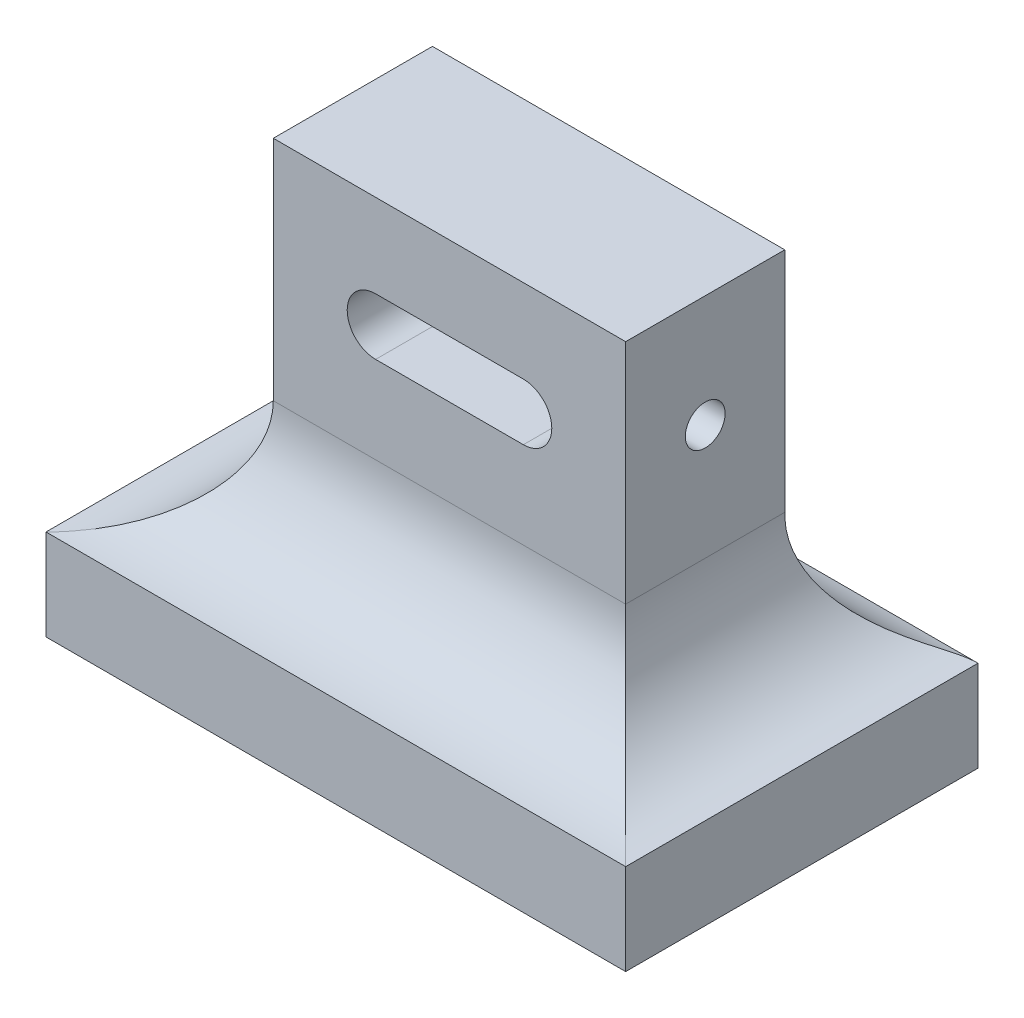
ISO-10303-21;
HEADER;
FILE_DESCRIPTION(('STEP AP214'),'2;1');
FILE_NAME('part.step','',(''),(''),'','','');
FILE_SCHEMA(('AUTOMOTIVE_DESIGN { 1 0 10303 214 1 1 1 1 }'));
ENDSEC;
DATA;
#1=APPLICATION_CONTEXT('core data for automotive mechanical design processes');
#2=APPLICATION_PROTOCOL_DEFINITION('international standard','automotive_design',2000,#1);
#3=PRODUCT_CONTEXT('',#1,'mechanical');
#4=PRODUCT('Part','Part','',(#3));
#5=PRODUCT_RELATED_PRODUCT_CATEGORY('part','',(#4));
#6=PRODUCT_DEFINITION_FORMATION('','',#4);
#7=PRODUCT_DEFINITION_CONTEXT('part definition',#1,'design');
#8=PRODUCT_DEFINITION('design','',#6,#7);
#9=PRODUCT_DEFINITION_SHAPE('','',#8);
#10=(LENGTH_UNIT() NAMED_UNIT(*) SI_UNIT(.MILLI.,.METRE.));
#11=(NAMED_UNIT(*) PLANE_ANGLE_UNIT() SI_UNIT($,.RADIAN.));
#12=(NAMED_UNIT(*) SI_UNIT($,.STERADIAN.) SOLID_ANGLE_UNIT());
#13=UNCERTAINTY_MEASURE_WITH_UNIT(LENGTH_MEASURE(1.E-05),#10,'distance_accuracy_value','');
#14=(GEOMETRIC_REPRESENTATION_CONTEXT(3) GLOBAL_UNCERTAINTY_ASSIGNED_CONTEXT((#13)) GLOBAL_UNIT_ASSIGNED_CONTEXT((#10,
#11,#12)) REPRESENTATION_CONTEXT('',''));
#15=CARTESIAN_POINT('',(0.,0.,0.));
#16=DIRECTION('',(0.,0.,1.));
#17=DIRECTION('',(1.,0.,0.));
#18=AXIS2_PLACEMENT_3D('',#15,#16,#17);
#19=CARTESIAN_POINT('',(0.,8.,0.));
#20=DIRECTION('',(1.,0.,0.));
#21=DIRECTION('',(0.,0.,-1.));
#22=AXIS2_PLACEMENT_3D('',#19,#20,#21);
#23=PLANE('',#22);
#24=DIRECTION('',(0.,0.,1.));
#25=VECTOR('',#24,1.);
#26=CARTESIAN_POINT('',(0.,0.,0.));
#27=LINE('',#26,#25);
#28=CARTESIAN_POINT('',(0.,0.,-31.));
#29=VERTEX_POINT('',#28);
#30=CARTESIAN_POINT('',(0.,0.,0.));
#31=VERTEX_POINT('',#30);
#32=EDGE_CURVE('E188',#29,#31,#27,.T.);
#33=ORIENTED_EDGE('',*,*,#32,.T.);
#34=DIRECTION('',(0.,-1.,0.));
#35=VECTOR('',#34,1.);
#36=CARTESIAN_POINT('',(0.,8.,0.));
#37=LINE('',#36,#35);
#38=CARTESIAN_POINT('',(0.,8.,0.));
#39=VERTEX_POINT('',#38);
#40=EDGE_CURVE('E226',#39,#31,#37,.T.);
#41=ORIENTED_EDGE('',*,*,#40,.F.);
#42=DIRECTION('',(0.,0.,1.));
#43=VECTOR('',#42,1.);
#44=CARTESIAN_POINT('',(0.,8.,0.));
#45=LINE('',#44,#43);
#46=CARTESIAN_POINT('',(0.,8.,-31.));
#47=VERTEX_POINT('',#46);
#48=EDGE_CURVE('E197',#47,#39,#45,.T.);
#49=ORIENTED_EDGE('',*,*,#48,.F.);
#50=DIRECTION('',(0.,-1.,0.));
#51=VECTOR('',#50,1.);
#52=CARTESIAN_POINT('',(0.,8.,-31.));
#53=LINE('',#52,#51);
#54=EDGE_CURVE('E210',#47,#29,#53,.T.);
#55=ORIENTED_EDGE('',*,*,#54,.T.);
#56=EDGE_LOOP('',(#33,#41,#49,#55));
#57=FACE_BOUND('',#56,.T.);
#58=ADVANCED_FACE('F35',(#57),#23,.F.);
#59=CARTESIAN_POINT('',(0.,8.,0.));
#60=DIRECTION('',(0.,0.,-1.));
#61=DIRECTION('',(-1.,0.,0.));
#62=AXIS2_PLACEMENT_3D('',#59,#60,#61);
#63=PLANE('',#62);
#64=DIRECTION('',(1.,0.,0.));
#65=VECTOR('',#64,1.);
#66=CARTESIAN_POINT('',(0.,0.,0.));
#67=LINE('',#66,#65);
#68=CARTESIAN_POINT('',(51.,0.,0.));
#69=VERTEX_POINT('',#68);
#70=EDGE_CURVE('E213',#31,#69,#67,.T.);
#71=ORIENTED_EDGE('',*,*,#70,.T.);
#72=DIRECTION('',(0.,-1.,0.));
#73=VECTOR('',#72,1.);
#74=CARTESIAN_POINT('',(51.,8.,0.));
#75=LINE('',#74,#73);
#76=CARTESIAN_POINT('',(51.,8.,0.));
#77=VERTEX_POINT('',#76);
#78=EDGE_CURVE('E223',#77,#69,#75,.T.);
#79=ORIENTED_EDGE('',*,*,#78,.F.);
#80=DIRECTION('',(1.,0.,0.));
#81=VECTOR('',#80,1.);
#82=CARTESIAN_POINT('',(0.,8.,0.));
#83=LINE('',#82,#81);
#84=EDGE_CURVE('E200',#39,#77,#83,.T.);
#85=ORIENTED_EDGE('',*,*,#84,.F.);
#86=ORIENTED_EDGE('',*,*,#40,.T.);
#87=EDGE_LOOP('',(#71,#79,#85,#86));
#88=FACE_BOUND('',#87,.T.);
#89=ADVANCED_FACE('F287',(#88),#63,.F.);
#90=CARTESIAN_POINT('',(51.,8.,0.));
#91=DIRECTION('',(-1.,0.,0.));
#92=DIRECTION('',(0.,0.,1.));
#93=AXIS2_PLACEMENT_3D('',#90,#91,#92);
#94=PLANE('',#93);
#95=DIRECTION('',(0.,0.,-1.));
#96=VECTOR('',#95,1.);
#97=CARTESIAN_POINT('',(51.,0.,0.));
#98=LINE('',#97,#96);
#99=CARTESIAN_POINT('',(51.,0.,-31.));
#100=VERTEX_POINT('',#99);
#101=EDGE_CURVE('E215',#69,#100,#98,.T.);
#102=ORIENTED_EDGE('',*,*,#101,.T.);
#103=DIRECTION('',(0.,-1.,0.));
#104=VECTOR('',#103,1.);
#105=CARTESIAN_POINT('',(51.,8.,-31.));
#106=LINE('',#105,#104);
#107=CARTESIAN_POINT('',(51.,8.,-31.));
#108=VERTEX_POINT('',#107);
#109=EDGE_CURVE('E220',#108,#100,#106,.T.);
#110=ORIENTED_EDGE('',*,*,#109,.F.);
#111=DIRECTION('',(0.,0.,-1.));
#112=VECTOR('',#111,1.);
#113=CARTESIAN_POINT('',(51.,8.,0.));
#114=LINE('',#113,#112);
#115=EDGE_CURVE('E204',#77,#108,#114,.T.);
#116=ORIENTED_EDGE('',*,*,#115,.F.);
#117=ORIENTED_EDGE('',*,*,#78,.T.);
#118=EDGE_LOOP('',(#102,#110,#116,#117));
#119=FACE_BOUND('',#118,.T.);
#120=ADVANCED_FACE('F283',(#119),#94,.F.);
#121=CARTESIAN_POINT('',(0.,8.,-31.));
#122=DIRECTION('',(0.,0.,1.));
#123=DIRECTION('',(1.,0.,0.));
#124=AXIS2_PLACEMENT_3D('',#121,#122,#123);
#125=PLANE('',#124);
#126=DIRECTION('',(-1.,0.,0.));
#127=VECTOR('',#126,1.);
#128=CARTESIAN_POINT('',(0.,0.,-31.));
#129=LINE('',#128,#127);
#130=EDGE_CURVE('E201',#100,#29,#129,.T.);
#131=ORIENTED_EDGE('',*,*,#130,.T.);
#132=ORIENTED_EDGE('',*,*,#54,.F.);
#133=DIRECTION('',(-1.,0.,0.));
#134=VECTOR('',#133,1.);
#135=CARTESIAN_POINT('',(0.,8.,-31.));
#136=LINE('',#135,#134);
#137=EDGE_CURVE('E207',#108,#47,#136,.T.);
#138=ORIENTED_EDGE('',*,*,#137,.F.);
#139=ORIENTED_EDGE('',*,*,#109,.T.);
#140=EDGE_LOOP('',(#131,#132,#138,#139));
#141=FACE_BOUND('',#140,.T.);
#142=ADVANCED_FACE('F279',(#141),#125,.F.);
#143=CARTESIAN_POINT('',(0.,0.,0.));
#144=DIRECTION('',(0.,-1.,0.));
#145=DIRECTION('',(0.,0.,-1.));
#146=AXIS2_PLACEMENT_3D('',#143,#144,#145);
#147=PLANE('',#146);
#148=ORIENTED_EDGE('',*,*,#32,.F.);
#149=ORIENTED_EDGE('',*,*,#130,.F.);
#150=ORIENTED_EDGE('',*,*,#101,.F.);
#151=ORIENTED_EDGE('',*,*,#70,.F.);
#152=EDGE_LOOP('',(#148,#149,#150,#151));
#153=FACE_BOUND('',#152,.T.);
#154=ADVANCED_FACE('F275',(#153),#147,.T.);
#155=CARTESIAN_POINT('',(41.,38.,-24.));
#156=DIRECTION('',(1.,0.,0.));
#157=DIRECTION('',(0.,0.,-1.));
#158=AXIS2_PLACEMENT_3D('',#155,#156,#157);
#159=PLANE('',#158);
#160=CARTESIAN_POINT('',(41.,28.15,-17.));
#161=DIRECTION('',(1.,0.,0.));
#162=DIRECTION('',(0.,0.,-1.));
#163=AXIS2_PLACEMENT_3D('',#160,#161,#162);
#164=CIRCLE('',#163,1.75);
#165=CARTESIAN_POINT('',(41.,28.15,-18.75));
#166=VERTEX_POINT('',#165);
#167=EDGE_CURVE('E511',#166,#166,#164,.T.);
#168=ORIENTED_EDGE('',*,*,#167,.F.);
#169=EDGE_LOOP('',(#168));
#170=FACE_BOUND('',#169,.T.);
#171=DIRECTION('',(0.,-1.,0.));
#172=VECTOR('',#171,1.);
#173=CARTESIAN_POINT('',(41.,38.,-10.));
#174=LINE('',#173,#172);
#175=CARTESIAN_POINT('',(41.,38.,-10.));
#176=VERTEX_POINT('',#175);
#177=CARTESIAN_POINT('',(41.,18.,-10.));
#178=VERTEX_POINT('',#177);
#179=EDGE_CURVE('E185',#176,#178,#174,.T.);
#180=ORIENTED_EDGE('',*,*,#179,.T.);
#181=DIRECTION('',(0.,0.,1.));
#182=VECTOR('',#181,1.);
#183=CARTESIAN_POINT('',(41.,18.,-24.));
#184=LINE('',#183,#182);
#185=CARTESIAN_POINT('',(41.,18.,-24.));
#186=VERTEX_POINT('',#185);
#187=EDGE_CURVE('E239',#178,#186,#184,.F.);
#188=ORIENTED_EDGE('',*,*,#187,.T.);
#189=DIRECTION('',(0.,-1.,0.));
#190=VECTOR('',#189,1.);
#191=CARTESIAN_POINT('',(41.,38.,-24.));
#192=LINE('',#191,#190);
#193=CARTESIAN_POINT('',(41.,38.,-24.));
#194=VERTEX_POINT('',#193);
#195=EDGE_CURVE('E186',#194,#186,#192,.T.);
#196=ORIENTED_EDGE('',*,*,#195,.F.);
#197=DIRECTION('',(0.,0.,1.));
#198=VECTOR('',#197,1.);
#199=CARTESIAN_POINT('',(41.,38.,-24.));
#200=LINE('',#199,#198);
#201=EDGE_CURVE('E173',#194,#176,#200,.T.);
#202=ORIENTED_EDGE('',*,*,#201,.T.);
#203=EDGE_LOOP('',(#180,#188,#196,#202));
#204=FACE_BOUND('',#203,.T.);
#205=ADVANCED_FACE('F262',(#170,#204),#159,.T.);
#206=CARTESIAN_POINT('',(41.,38.,-24.));
#207=DIRECTION('',(0.,0.,1.));
#208=DIRECTION('',(1.,0.,0.));
#209=AXIS2_PLACEMENT_3D('',#206,#207,#208);
#210=PLANE('',#209);
#211=DIRECTION('',(-1.,0.,0.));
#212=VECTOR('',#211,1.);
#213=CARTESIAN_POINT('',(32.0000000974318,25.65,-24.));
#214=LINE('',#213,#212);
#215=CARTESIAN_POINT('',(32.0000000974318,25.65,-24.));
#216=VERTEX_POINT('',#215);
#217=CARTESIAN_POINT('',(18.9999999025682,25.65,-24.));
#218=VERTEX_POINT('',#217);
#219=EDGE_CURVE('E157',#216,#218,#214,.T.);
#220=ORIENTED_EDGE('',*,*,#219,.F.);
#221=CARTESIAN_POINT('',(32.0000000974318,28.15,-24.));
#222=DIRECTION('',(0.,0.,-1.));
#223=DIRECTION('',(1.,0.,0.));
#224=AXIS2_PLACEMENT_3D('',#221,#222,#223);
#225=CIRCLE('',#224,2.5);
#226=CARTESIAN_POINT('',(32.0000000974318,30.65,-24.));
#227=VERTEX_POINT('',#226);
#228=EDGE_CURVE('E162',#227,#216,#225,.T.);
#229=ORIENTED_EDGE('',*,*,#228,.F.);
#230=DIRECTION('',(1.,0.,0.));
#231=VECTOR('',#230,1.);
#232=CARTESIAN_POINT('',(32.0000000974318,30.65,-24.));
#233=LINE('',#232,#231);
#234=CARTESIAN_POINT('',(18.9999999025682,30.65,-24.));
#235=VERTEX_POINT('',#234);
#236=EDGE_CURVE('E166',#235,#227,#233,.T.);
#237=ORIENTED_EDGE('',*,*,#236,.F.);
#238=CARTESIAN_POINT('',(18.9999999025682,28.15,-24.));
#239=DIRECTION('',(0.,0.,-1.));
#240=DIRECTION('',(-1.,0.,0.));
#241=AXIS2_PLACEMENT_3D('',#238,#239,#240);
#242=CIRCLE('',#241,2.5);
#243=EDGE_CURVE('E146',#218,#235,#242,.T.);
#244=ORIENTED_EDGE('',*,*,#243,.F.);
#245=EDGE_LOOP('',(#220,#229,#237,#244));
#246=FACE_BOUND('',#245,.T.);
#247=CARTESIAN_POINT('',(51.,18.,-24.));
#248=DIRECTION('',(0.,0.,1.));
#249=DIRECTION('',(1.,0.,0.));
#250=AXIS2_PLACEMENT_3D('',#247,#248,#249);
#251=CIRCLE('',#250,10.);
#252=CARTESIAN_POINT('',(41.0106136182752,17.5393920141695,-24.));
#253=VERTEX_POINT('',#252);
#254=EDGE_CURVE('E56',#186,#253,#251,.T.);
#255=ORIENTED_EDGE('',*,*,#254,.T.);
#256=CARTESIAN_POINT('',(41.0106136182752,17.5393920141695,-24.));
#257=CARTESIAN_POINT('',(41.,17.5393920141695,-24.));
#258=B_SPLINE_CURVE_WITH_KNOTS('',1,(#256,#257),.UNSPECIFIED.,.F.,.F.,(2,2),(0.,1.),.UNSPECIFIED.);
#259=CARTESIAN_POINT('',(41.,17.5393920141695,-24.));
#260=VERTEX_POINT('',#259);
#261=EDGE_CURVE('E11',#253,#260,#258,.T.);
#262=ORIENTED_EDGE('',*,*,#261,.T.);
#263=DIRECTION('',(-1.,0.,0.));
#264=VECTOR('',#263,1.);
#265=CARTESIAN_POINT('',(41.,17.5393920141695,-24.));
#266=LINE('',#265,#264);
#267=CARTESIAN_POINT('',(9.99999999999999,17.5393920141695,-24.));
#268=VERTEX_POINT('',#267);
#269=EDGE_CURVE('E243',#260,#268,#266,.T.);
#270=ORIENTED_EDGE('',*,*,#269,.T.);
#271=CARTESIAN_POINT('',(9.99999999999999,17.5393920141695,-24.));
#272=CARTESIAN_POINT('',(9.9893863817248,17.5393920141695,-24.));
#273=B_SPLINE_CURVE_WITH_KNOTS('',1,(#271,#272),.UNSPECIFIED.,.F.,.F.,(2,2),(0.,1.),.UNSPECIFIED.);
#274=CARTESIAN_POINT('',(9.9893863817248,17.5393920141695,-24.));
#275=VERTEX_POINT('',#274);
#276=EDGE_CURVE('E49',#268,#275,#273,.T.);
#277=ORIENTED_EDGE('',*,*,#276,.T.);
#278=CARTESIAN_POINT('',(0.,18.,-24.));
#279=DIRECTION('',(0.,0.,1.));
#280=DIRECTION('',(1.,0.,0.));
#281=AXIS2_PLACEMENT_3D('',#278,#279,#280);
#282=CIRCLE('',#281,10.);
#283=CARTESIAN_POINT('',(9.99999999999999,18.,-24.));
#284=VERTEX_POINT('',#283);
#285=EDGE_CURVE('E245',#275,#284,#282,.T.);
#286=ORIENTED_EDGE('',*,*,#285,.T.);
#287=DIRECTION('',(0.,-1.,0.));
#288=VECTOR('',#287,1.);
#289=CARTESIAN_POINT('',(9.99999999999999,38.,-24.));
#290=LINE('',#289,#288);
#291=CARTESIAN_POINT('',(9.99999999999999,38.,-24.));
#292=VERTEX_POINT('',#291);
#293=EDGE_CURVE('E189',#292,#284,#290,.T.);
#294=ORIENTED_EDGE('',*,*,#293,.F.);
#295=DIRECTION('',(-1.,0.,0.));
#296=VECTOR('',#295,1.);
#297=CARTESIAN_POINT('',(41.,38.,-24.));
#298=LINE('',#297,#296);
#299=EDGE_CURVE('E183',#194,#292,#298,.T.);
#300=ORIENTED_EDGE('',*,*,#299,.F.);
#301=ORIENTED_EDGE('',*,*,#195,.T.);
#302=EDGE_LOOP('',(#255,#262,#270,#277,#286,#294,#300,#301));
#303=FACE_BOUND('',#302,.T.);
#304=ADVANCED_FACE('F164',(#246,#303),#210,.F.);
#305=CARTESIAN_POINT('',(9.99999999999999,38.,-24.));
#306=DIRECTION('',(1.,0.,0.));
#307=DIRECTION('',(0.,0.,-1.));
#308=AXIS2_PLACEMENT_3D('',#305,#306,#307);
#309=PLANE('',#308);
#310=CARTESIAN_POINT('',(9.99999999999999,28.15,-17.));
#311=DIRECTION('',(1.,0.,0.));
#312=DIRECTION('',(0.,0.,-1.));
#313=AXIS2_PLACEMENT_3D('',#310,#311,#312);
#314=CIRCLE('',#313,1.75);
#315=CARTESIAN_POINT('',(9.99999999999999,28.15,-18.75));
#316=VERTEX_POINT('',#315);
#317=EDGE_CURVE('E323',#316,#316,#314,.T.);
#318=ORIENTED_EDGE('',*,*,#317,.T.);
#319=EDGE_LOOP('',(#318));
#320=FACE_BOUND('',#319,.T.);
#321=ORIENTED_EDGE('',*,*,#293,.T.);
#322=DIRECTION('',(0.,0.,1.));
#323=VECTOR('',#322,1.);
#324=CARTESIAN_POINT('',(9.99999999999999,18.,-10.));
#325=LINE('',#324,#323);
#326=CARTESIAN_POINT('',(9.99999999999999,18.,-10.));
#327=VERTEX_POINT('',#326);
#328=EDGE_CURVE('E236',#284,#327,#325,.T.);
#329=ORIENTED_EDGE('',*,*,#328,.T.);
#330=DIRECTION('',(0.,-1.,0.));
#331=VECTOR('',#330,1.);
#332=CARTESIAN_POINT('',(9.99999999999999,38.,-10.));
#333=LINE('',#332,#331);
#334=CARTESIAN_POINT('',(9.99999999999999,38.,-10.));
#335=VERTEX_POINT('',#334);
#336=EDGE_CURVE('E192',#335,#327,#333,.T.);
#337=ORIENTED_EDGE('',*,*,#336,.F.);
#338=DIRECTION('',(0.,0.,1.));
#339=VECTOR('',#338,1.);
#340=CARTESIAN_POINT('',(9.99999999999999,38.,-24.));
#341=LINE('',#340,#339);
#342=EDGE_CURVE('E181',#292,#335,#341,.T.);
#343=ORIENTED_EDGE('',*,*,#342,.F.);
#344=EDGE_LOOP('',(#321,#329,#337,#343));
#345=FACE_BOUND('',#344,.T.);
#346=ADVANCED_FACE('F261',(#320,#345),#309,.F.);
#347=CARTESIAN_POINT('',(41.,38.,-10.));
#348=DIRECTION('',(0.,0.,1.));
#349=DIRECTION('',(1.,0.,0.));
#350=AXIS2_PLACEMENT_3D('',#347,#348,#349);
#351=PLANE('',#350);
#352=CARTESIAN_POINT('',(32.0000000974318,28.15,-10.));
#353=DIRECTION('',(0.,0.,1.));
#354=DIRECTION('',(1.,0.,0.));
#355=AXIS2_PLACEMENT_3D('',#352,#353,#354);
#356=CIRCLE('',#355,2.5);
#357=CARTESIAN_POINT('',(32.0000000974318,25.65,-10.));
#358=VERTEX_POINT('',#357);
#359=CARTESIAN_POINT('',(32.0000000974318,30.65,-10.));
#360=VERTEX_POINT('',#359);
#361=EDGE_CURVE('E234',#358,#360,#356,.T.);
#362=ORIENTED_EDGE('',*,*,#361,.F.);
#363=DIRECTION('',(1.,0.,0.));
#364=VECTOR('',#363,1.);
#365=CARTESIAN_POINT('',(41.,25.65,-10.));
#366=LINE('',#365,#364);
#367=CARTESIAN_POINT('',(18.9999999025682,25.65,-10.));
#368=VERTEX_POINT('',#367);
#369=EDGE_CURVE('E229',#368,#358,#366,.T.);
#370=ORIENTED_EDGE('',*,*,#369,.F.);
#371=CARTESIAN_POINT('',(18.9999999025682,28.15,-10.));
#372=DIRECTION('',(0.,0.,1.));
#373=DIRECTION('',(1.,0.,0.));
#374=AXIS2_PLACEMENT_3D('',#371,#372,#373);
#375=CIRCLE('',#374,2.5);
#376=CARTESIAN_POINT('',(18.9999999025682,30.65,-10.));
#377=VERTEX_POINT('',#376);
#378=EDGE_CURVE('E149',#377,#368,#375,.T.);
#379=ORIENTED_EDGE('',*,*,#378,.F.);
#380=DIRECTION('',(-1.,0.,0.));
#381=VECTOR('',#380,1.);
#382=CARTESIAN_POINT('',(41.,30.65,-10.));
#383=LINE('',#382,#381);
#384=EDGE_CURVE('E232',#360,#377,#383,.T.);
#385=ORIENTED_EDGE('',*,*,#384,.F.);
#386=EDGE_LOOP('',(#362,#370,#379,#385));
#387=FACE_BOUND('',#386,.T.);
#388=ORIENTED_EDGE('',*,*,#336,.T.);
#389=DIRECTION('',(-1.,0.,0.));
#390=VECTOR('',#389,1.);
#391=CARTESIAN_POINT('',(41.,18.,-10.));
#392=LINE('',#391,#390);
#393=EDGE_CURVE('E241',#327,#178,#392,.F.);
#394=ORIENTED_EDGE('',*,*,#393,.T.);
#395=ORIENTED_EDGE('',*,*,#179,.F.);
#396=DIRECTION('',(-1.,0.,0.));
#397=VECTOR('',#396,1.);
#398=CARTESIAN_POINT('',(41.,38.,-10.));
#399=LINE('',#398,#397);
#400=EDGE_CURVE('E178',#176,#335,#399,.T.);
#401=ORIENTED_EDGE('',*,*,#400,.T.);
#402=EDGE_LOOP('',(#388,#394,#395,#401));
#403=FACE_BOUND('',#402,.T.);
#404=ADVANCED_FACE('F268',(#387,#403),#351,.T.);
#405=CARTESIAN_POINT('',(0.,38.,0.));
#406=DIRECTION('',(0.,-1.,0.));
#407=DIRECTION('',(0.,0.,-1.));
#408=AXIS2_PLACEMENT_3D('',#405,#406,#407);
#409=PLANE('',#408);
#410=ORIENTED_EDGE('',*,*,#201,.F.);
#411=ORIENTED_EDGE('',*,*,#299,.T.);
#412=ORIENTED_EDGE('',*,*,#342,.T.);
#413=ORIENTED_EDGE('',*,*,#400,.F.);
#414=EDGE_LOOP('',(#410,#411,#412,#413));
#415=FACE_BOUND('',#414,.T.);
#416=ADVANCED_FACE('F263',(#415),#409,.F.);
#417=CARTESIAN_POINT('',(32.0000000974318,28.15,0.));
#418=DIRECTION('',(0.,0.,-1.));
#419=DIRECTION('',(-1.,0.,0.));
#420=AXIS2_PLACEMENT_3D('',#417,#418,#419);
#421=CYLINDRICAL_SURFACE('',#420,2.5);
#422=CARTESIAN_POINT('',(34.5000000974318,28.15,-18.75));
#423=CARTESIAN_POINT('',(34.5000042767836,28.2370272806307,-18.7500045149887));
#424=CARTESIAN_POINT('',(34.4954195708485,28.3240313263331,-18.7434745046267));
#425=CARTESIAN_POINT('',(34.4775438983813,28.4952338019847,-18.7177916983242));
#426=CARTESIAN_POINT('',(34.4642503549277,28.5794313937601,-18.6986351662201));
#427=CARTESIAN_POINT('',(34.4302471323048,28.7422810425608,-18.6489167404495));
#428=CARTESIAN_POINT('',(34.4095733537219,28.8209577762634,-18.6184100290487));
#429=CARTESIAN_POINT('',(34.3624269428744,28.9716959115283,-18.5473418517508));
#430=CARTESIAN_POINT('',(34.3359534644451,29.0437563456061,-18.5067789185571));
#431=CARTESIAN_POINT('',(34.2764732999534,29.1864156046356,-18.4128938780296));
#432=CARTESIAN_POINT('',(34.2430960996111,29.256323194916,-18.3587612712889));
#433=CARTESIAN_POINT('',(34.1739456034473,29.3866971528775,-18.2412878976944));
#434=CARTESIAN_POINT('',(34.1381687654904,29.4471491043503,-18.1779333494161));
#435=CARTESIAN_POINT('',(34.0605340757815,29.5678142726796,-18.0309612662512));
#436=CARTESIAN_POINT('',(34.0187145729931,29.6261116438206,-17.9457400365667));
#437=CARTESIAN_POINT('',(33.9404397304068,29.7275908234118,-17.7644942617342));
#438=CARTESIAN_POINT('',(33.9039754789533,29.7707979125754,-17.668488144673));
#439=CARTESIAN_POINT('',(33.8524221493881,29.8291525652865,-17.4983173413232));
#440=CARTESIAN_POINT('',(33.834213068763,29.848848321359,-17.4266691292954));
#441=CARTESIAN_POINT('',(33.8057544320717,29.8790720362841,-17.2799864428518));
#442=CARTESIAN_POINT('',(33.7954892983181,29.8896179424875,-17.2049589025934));
#443=CARTESIAN_POINT('',(33.7845310546521,29.9008627944185,-17.0530029710237));
#444=CARTESIAN_POINT('',(33.7838928338935,29.9015052748718,-16.9760661830345));
#445=CARTESIAN_POINT('',(33.7924536241979,29.8927396216041,-16.8233032755801));
#446=CARTESIAN_POINT('',(33.8016594011022,29.8833245752864,-16.7474779563661));
#447=CARTESIAN_POINT('',(33.8274522254652,29.8560872523364,-16.6040860486982));
#448=CARTESIAN_POINT('',(33.8435118490687,29.8388610440455,-16.5363047116314));
#449=CARTESIAN_POINT('',(33.8809573565636,29.7970542136985,-16.4046063382046));
#450=CARTESIAN_POINT('',(33.9023475082902,29.772467695492,-16.3406924494863));
#451=CARTESIAN_POINT('',(33.9608518900352,29.701811440696,-16.184434826859));
#452=CARTESIAN_POINT('',(34.0002913056939,29.6512620055072,-16.0949771515981));
#453=CARTESIAN_POINT('',(34.0817692730736,29.5360867952903,-15.9268375733802));
#454=CARTESIAN_POINT('',(34.1238129842507,29.4714323934321,-15.8481781228575));
#455=CARTESIAN_POINT('',(34.2065986974959,29.3280750475249,-15.7018292617579));
#456=CARTESIAN_POINT('',(34.2473192496082,29.2492140499808,-15.634281566013));
#457=CARTESIAN_POINT('',(34.3228554716896,29.0789636881774,-15.5132641874956));
#458=CARTESIAN_POINT('',(34.3576833279186,28.9876009040873,-15.4597653215744));
#459=CARTESIAN_POINT('',(34.4110832569949,28.8155167396835,-15.379349792761));
#460=CARTESIAN_POINT('',(34.4315468526442,28.736906618908,-15.3491713261282));
#461=CARTESIAN_POINT('',(34.4650501553538,28.5746959093143,-15.3002077843235));
#462=CARTESIAN_POINT('',(34.4780949185407,28.4910987623181,-15.2814149489772));
#463=CARTESIAN_POINT('',(34.4956321414922,28.3208007911528,-15.2562218497902));
#464=CARTESIAN_POINT('',(34.5000898997852,28.2340888101697,-15.2498718677538));
#465=CARTESIAN_POINT('',(34.4999075713847,28.0606922611119,-15.2501320232454));
#466=CARTESIAN_POINT('',(34.4952678957414,27.9740076919757,-15.2567415752218));
#467=CARTESIAN_POINT('',(34.4779416386633,27.8090606544738,-15.2816385857341));
#468=CARTESIAN_POINT('',(34.4657999316546,27.7306177290883,-15.2991358331591));
#469=CARTESIAN_POINT('',(34.4349434670596,27.5780619129424,-15.3441866503338));
#470=CARTESIAN_POINT('',(34.4162274833835,27.5039498328854,-15.3717420959554));
#471=CARTESIAN_POINT('',(34.3720121329583,27.356330999923,-15.438079257212));
#472=CARTESIAN_POINT('',(34.3461267741801,27.2832373809613,-15.4775168609928));
#473=CARTESIAN_POINT('',(34.2900913315513,27.144468973485,-15.5653702705986));
#474=CARTESIAN_POINT('',(34.2599385700407,27.0787988898978,-15.6137917194789));
#475=CARTESIAN_POINT('',(34.1918606099281,26.9448830455884,-15.7275302087342));
#476=CARTESIAN_POINT('',(34.1534878942733,26.8781161066735,-15.7943204867347));
#477=CARTESIAN_POINT('',(34.0765951972282,26.7561009526043,-15.9377286042172));
#478=CARTESIAN_POINT('',(34.0380751235503,26.7008618649609,-16.0143541541214));
#479=CARTESIAN_POINT('',(33.9681843365936,26.6074962594677,-16.1690112651081));
#480=CARTESIAN_POINT('',(33.9364822181945,26.568237888859,-16.2462062840651));
#481=CARTESIAN_POINT('',(33.8795758445428,26.5010188030741,-16.40757761454));
#482=CARTESIAN_POINT('',(33.8543589280688,26.4730360127875,-16.4917398922286));
#483=CARTESIAN_POINT('',(33.8184530990002,26.4342534493978,-16.6481172855446));
#484=CARTESIAN_POINT('',(33.8058572155153,26.4211228027138,-16.7193051236333));
#485=CARTESIAN_POINT('',(33.7891226831941,26.4038058446184,-16.8637067088704));
#486=CARTESIAN_POINT('',(33.7849730730855,26.3996079402906,-16.9369177051383));
#487=CARTESIAN_POINT('',(33.785798685276,26.4004505687669,-17.083320099052));
#488=CARTESIAN_POINT('',(33.7907848717026,26.4055022021979,-17.1565113675771));
#489=CARTESIAN_POINT('',(33.8090825065318,26.4244896946601,-17.3007017225225));
#490=CARTESIAN_POINT('',(33.8224061123501,26.4384385279396,-17.371697448532));
#491=CARTESIAN_POINT('',(33.8602334100051,26.4795190472122,-17.5295230514212));
#492=CARTESIAN_POINT('',(33.8868323178648,26.509261900947,-17.6151591842471));
#493=CARTESIAN_POINT('',(33.9464096625906,26.5804020740925,-17.7790225466749));
#494=CARTESIAN_POINT('',(33.9793979885796,26.6218175053717,-17.8572380078033));
#495=CARTESIAN_POINT('',(34.0489113999111,26.7163035256669,-18.0075078345549));
#496=CARTESIAN_POINT('',(34.0855019534928,26.7696279460313,-18.0793713658863));
#497=CARTESIAN_POINT('',(34.1584077297219,26.8866564377792,-18.2142649919782));
#498=CARTESIAN_POINT('',(34.1947228571325,26.9503639422103,-18.2772921522287));
#499=CARTESIAN_POINT('',(34.2707914090374,27.1003289765284,-18.4042912804869));
#500=CARTESIAN_POINT('',(34.3099488853913,27.1885789095483,-18.4663052410749));
#501=CARTESIAN_POINT('',(34.3797981523342,27.3775598954131,-18.5740443214951));
#502=CARTESIAN_POINT('',(34.410499813299,27.4782761955633,-18.6197884512521));
#503=CARTESIAN_POINT('',(34.4558679393003,27.6733638670692,-18.6865011560205));
#504=CARTESIAN_POINT('',(34.4722530362415,27.766406304389,-18.7101635271713));
#505=CARTESIAN_POINT('',(34.4943099600531,27.9563121047049,-18.7419004993204));
#506=CARTESIAN_POINT('',(34.4999954473402,28.0531704342596,-18.7499949764672));
#507=CARTESIAN_POINT('',(34.5000000974318,28.15,-18.75));
#508=B_SPLINE_CURVE_WITH_KNOTS('',3,(#422,#423,#424,#425,#426,#427,#428,#429,#430,#431,#432,
#433,#434,#435,#436,#437,#438,#439,#440,#441,#442,#443,#444,#445,#446,#447,#448,#449,#450,#451,
#452,#453,#454,#455,#456,#457,#458,#459,#460,#461,#462,#463,#464,#465,#466,#467,#468,#469,#470,
#471,#472,#473,#474,#475,#476,#477,#478,#479,#480,#481,#482,#483,#484,#485,#486,#487,#488,#489,
#490,#491,#492,#493,#494,#495,#496,#497,#498,#499,#500,#501,#502,#503,#504,#505,#506,#507),
.UNSPECIFIED.,.T.,.F.,(4,2,2,2,2,2,2,2,2,2,2,2,2,2,2,2,2,2,2,2,2,2,2,2,2,2,2,2,2,2,2,2,2,2,2,2,
2,2,2,2,2,2,4),(0.,0.260691779269082,0.521460731389294,0.780978101362165,1.04053335965115,
1.32301333452968,1.60591987073401,1.93863463581598,2.27078930038453,2.49943939217372,
2.72763996822687,2.95714117224209,3.18680021531933,3.40129749690535,3.61596706851561,
3.94441405320527,4.27353394611448,4.60657119588279,4.93891106625193,5.1977953329335,
5.45650295119185,5.71625387326352,5.97599305926016,6.21878245878816,6.46161716213052,
6.72161784328113,6.98178239593968,7.28642204868669,7.59130200116371,7.8670009109915,
8.14215740932882,8.36165195383568,8.58086146406301,8.80033422615654,9.02012776606562,
9.30202193352867,9.58435593596874,9.87340651252977,10.1625528549551,10.5048761847685,
10.8467982144163,11.1372239593292,11.4272786593702),.UNSPECIFIED.);
#509=CARTESIAN_POINT('',(34.5000000974318,28.15,-18.75));
#510=VERTEX_POINT('',#509);
#511=EDGE_CURVE('E327',#510,#510,#508,.T.);
#512=ORIENTED_EDGE('',*,*,#511,.T.);
#513=EDGE_LOOP('',(#512));
#514=FACE_BOUND('',#513,.T.);
#515=ORIENTED_EDGE('',*,*,#361,.T.);
#516=DIRECTION('',(0.,0.,-1.));
#517=VECTOR('',#516,1.);
#518=CARTESIAN_POINT('',(32.0000000974318,30.65,0.));
#519=LINE('',#518,#517);
#520=EDGE_CURVE('E171',#360,#227,#519,.T.);
#521=ORIENTED_EDGE('',*,*,#520,.T.);
#522=ORIENTED_EDGE('',*,*,#228,.T.);
#523=DIRECTION('',(0.,0.,-1.));
#524=VECTOR('',#523,1.);
#525=CARTESIAN_POINT('',(32.0000000974318,25.65,0.));
#526=LINE('',#525,#524);
#527=EDGE_CURVE('E153',#358,#216,#526,.T.);
#528=ORIENTED_EDGE('',*,*,#527,.F.);
#529=EDGE_LOOP('',(#515,#521,#522,#528));
#530=FACE_BOUND('',#529,.T.);
#531=ADVANCED_FACE('F336',(#514,#530),#421,.F.);
#532=CARTESIAN_POINT('',(32.0000000974318,30.65,0.));
#533=DIRECTION('',(0.,1.,0.));
#534=DIRECTION('',(0.,0.,1.));
#535=AXIS2_PLACEMENT_3D('',#532,#533,#534);
#536=PLANE('',#535);
#537=ORIENTED_EDGE('',*,*,#384,.T.);
#538=DIRECTION('',(0.,0.,-1.));
#539=VECTOR('',#538,1.);
#540=CARTESIAN_POINT('',(18.9999999025682,30.65,0.));
#541=LINE('',#540,#539);
#542=EDGE_CURVE('E152',#377,#235,#541,.T.);
#543=ORIENTED_EDGE('',*,*,#542,.T.);
#544=ORIENTED_EDGE('',*,*,#236,.T.);
#545=ORIENTED_EDGE('',*,*,#520,.F.);
#546=EDGE_LOOP('',(#537,#543,#544,#545));
#547=FACE_BOUND('',#546,.T.);
#548=ADVANCED_FACE('F341',(#547),#536,.F.);
#549=CARTESIAN_POINT('',(18.9999999025682,28.15,0.));
#550=DIRECTION('',(0.,0.,-1.));
#551=DIRECTION('',(-1.,0.,0.));
#552=AXIS2_PLACEMENT_3D('',#549,#550,#551);
#553=CYLINDRICAL_SURFACE('',#552,2.5);
#554=CARTESIAN_POINT('',(16.4999999025682,28.15,-18.75));
#555=CARTESIAN_POINT('',(16.4999957232164,28.0629727193693,-18.7500045149887));
#556=CARTESIAN_POINT('',(16.5045804291515,27.9759686736669,-18.7434745046267));
#557=CARTESIAN_POINT('',(16.5224561016187,27.8047661980153,-18.7177916983242));
#558=CARTESIAN_POINT('',(16.5357496450723,27.7205686062399,-18.6986351662201));
#559=CARTESIAN_POINT('',(16.5697528676952,27.5577189574392,-18.6489167404495));
#560=CARTESIAN_POINT('',(16.5904266462781,27.4790422237366,-18.6184100290487));
#561=CARTESIAN_POINT('',(16.6375730571256,27.3283040884717,-18.5473418517508));
#562=CARTESIAN_POINT('',(16.6640465355549,27.2562436543939,-18.5067789185571));
#563=CARTESIAN_POINT('',(16.7235267000466,27.1135843953644,-18.4128938780296));
#564=CARTESIAN_POINT('',(16.7569039003889,27.043676805084,-18.3587612712889));
#565=CARTESIAN_POINT('',(16.8260543965527,26.9133028471225,-18.2412878976944));
#566=CARTESIAN_POINT('',(16.8618312345096,26.8528508956497,-18.1779333494161));
#567=CARTESIAN_POINT('',(16.9394659242185,26.7321857273204,-18.0309612662512));
#568=CARTESIAN_POINT('',(16.9812854270069,26.6738883561794,-17.9457400365667));
#569=CARTESIAN_POINT('',(17.0595602695932,26.5724091765882,-17.7644942617342));
#570=CARTESIAN_POINT('',(17.0960245210467,26.5292020874246,-17.668488144673));
#571=CARTESIAN_POINT('',(17.1475778506119,26.4708474347135,-17.4983173413232));
#572=CARTESIAN_POINT('',(17.165786931237,26.451151678641,-17.4266691292954));
#573=CARTESIAN_POINT('',(17.1942455679283,26.4209279637159,-17.2799864428518));
#574=CARTESIAN_POINT('',(17.2045107016819,26.4103820575125,-17.2049589025934));
#575=CARTESIAN_POINT('',(17.2154689453479,26.3991372055815,-17.0530029710237));
#576=CARTESIAN_POINT('',(17.2161071661065,26.3984947251282,-16.9760661830345));
#577=CARTESIAN_POINT('',(17.2075463758021,26.4072603783959,-16.8233032755801));
#578=CARTESIAN_POINT('',(17.1983405988978,26.4166754247135,-16.7474779563661));
#579=CARTESIAN_POINT('',(17.1725477745348,26.4439127476636,-16.6040860486982));
#580=CARTESIAN_POINT('',(17.1564881509313,26.4611389559545,-16.5363047116314));
#581=CARTESIAN_POINT('',(17.1190426434364,26.5029457863015,-16.4046063382046));
#582=CARTESIAN_POINT('',(17.0976524917098,26.527532304508,-16.3406924494863));
#583=CARTESIAN_POINT('',(17.0391481099648,26.598188559304,-16.1844348268589));
#584=CARTESIAN_POINT('',(16.9997086943061,26.6487379944928,-16.0949771515981));
#585=CARTESIAN_POINT('',(16.9182307269264,26.7639132047097,-15.9268375733802));
#586=CARTESIAN_POINT('',(16.8761870157493,26.8285676065679,-15.8481781228575));
#587=CARTESIAN_POINT('',(16.7934013025041,26.9719249524751,-15.7018292617579));
#588=CARTESIAN_POINT('',(16.7526807503918,27.0507859500192,-15.634281566013));
#589=CARTESIAN_POINT('',(16.6771445283104,27.2210363118226,-15.5132641874956));
#590=CARTESIAN_POINT('',(16.6423166720814,27.3123990959128,-15.4597653215744));
#591=CARTESIAN_POINT('',(16.5889167430051,27.4844832603166,-15.3793497927609));
#592=CARTESIAN_POINT('',(16.5684531473558,27.563093381092,-15.3491713261281));
#593=CARTESIAN_POINT('',(16.5349498446462,27.7253040906858,-15.3002077843235));
#594=CARTESIAN_POINT('',(16.5219050814593,27.8089012376819,-15.2814149489772));
#595=CARTESIAN_POINT('',(16.5043678585077,27.9791992088472,-15.2562218497902));
#596=CARTESIAN_POINT('',(16.4999101002148,28.0659111898303,-15.2498718677538));
#597=CARTESIAN_POINT('',(16.5000924286153,28.2393077388881,-15.2501320232454));
#598=CARTESIAN_POINT('',(16.5047321042586,28.3259923080243,-15.2567415752218));
#599=CARTESIAN_POINT('',(16.5220583613367,28.4909393455262,-15.2816385857341));
#600=CARTESIAN_POINT('',(16.5342000683455,28.5693822709118,-15.2991358331591));
#601=CARTESIAN_POINT('',(16.5650565329404,28.7219380870577,-15.3441866503338));
#602=CARTESIAN_POINT('',(16.5837725166165,28.7960501671146,-15.3717420959554));
#603=CARTESIAN_POINT('',(16.6279878670417,28.943669000077,-15.438079257212));
#604=CARTESIAN_POINT('',(16.6538732258199,29.0167626190387,-15.4775168609928));
#605=CARTESIAN_POINT('',(16.7099086684487,29.155531026515,-15.5653702705986));
#606=CARTESIAN_POINT('',(16.7400614299593,29.2212011101022,-15.6137917194789));
#607=CARTESIAN_POINT('',(16.8081393900719,29.3551169544116,-15.7275302087342));
#608=CARTESIAN_POINT('',(16.8465121057267,29.4218838933265,-15.7943204867347));
#609=CARTESIAN_POINT('',(16.9234048027718,29.5438990473957,-15.9377286042172));
#610=CARTESIAN_POINT('',(16.9619248764497,29.5991381350391,-16.0143541541214));
#611=CARTESIAN_POINT('',(17.0318156634064,29.6925037405323,-16.1690112651081));
#612=CARTESIAN_POINT('',(17.0635177818055,29.731762111141,-16.2462062840651));
#613=CARTESIAN_POINT('',(17.1204241554572,29.7989811969259,-16.40757761454));
#614=CARTESIAN_POINT('',(17.1456410719312,29.8269639872125,-16.4917398922286));
#615=CARTESIAN_POINT('',(17.1815469009998,29.8657465506022,-16.6481172855446));
#616=CARTESIAN_POINT('',(17.1941427844848,29.8788771972862,-16.7193051236333));
#617=CARTESIAN_POINT('',(17.2108773168059,29.8961941553816,-16.8637067088704));
#618=CARTESIAN_POINT('',(17.2150269269145,29.9003920597094,-16.9369177051383));
#619=CARTESIAN_POINT('',(17.214201314724,29.8995494312331,-17.083320099052));
#620=CARTESIAN_POINT('',(17.2092151282974,29.8944977978021,-17.1565113675771));
#621=CARTESIAN_POINT('',(17.1909174934682,29.8755103053399,-17.3007017225225));
#622=CARTESIAN_POINT('',(17.1775938876499,29.8615614720604,-17.371697448532));
#623=CARTESIAN_POINT('',(17.1397665899949,29.8204809527878,-17.5295230514212));
#624=CARTESIAN_POINT('',(17.1131676821352,29.790738099053,-17.6151591842471));
#625=CARTESIAN_POINT('',(17.0535903374094,29.7195979259075,-17.7790225466749));
#626=CARTESIAN_POINT('',(17.0206020114204,29.6781824946283,-17.8572380078033));
#627=CARTESIAN_POINT('',(16.9510886000889,29.5836964743331,-18.0075078345549));
#628=CARTESIAN_POINT('',(16.9144980465072,29.5303720539687,-18.0793713658863));
#629=CARTESIAN_POINT('',(16.8415922702781,29.4133435622208,-18.2142649919782));
#630=CARTESIAN_POINT('',(16.8052771428675,29.3496360577897,-18.2772921522287));
#631=CARTESIAN_POINT('',(16.7292085909626,29.1996710234716,-18.4042912804869));
#632=CARTESIAN_POINT('',(16.6900511146087,29.1114210904517,-18.4663052410749));
#633=CARTESIAN_POINT('',(16.6202018476658,28.9224401045869,-18.5740443214951));
#634=CARTESIAN_POINT('',(16.589500186701,28.8217238044366,-18.6197884512521));
#635=CARTESIAN_POINT('',(16.5441320606997,28.6266361329308,-18.6865011560205));
#636=CARTESIAN_POINT('',(16.5277469637585,28.533593695611,-18.7101635271712));
#637=CARTESIAN_POINT('',(16.5056900399469,28.3436878952951,-18.7419004993204));
#638=CARTESIAN_POINT('',(16.5000045526598,28.2468295657404,-18.7499949764672));
#639=CARTESIAN_POINT('',(16.4999999025682,28.15,-18.75));
#640=B_SPLINE_CURVE_WITH_KNOTS('',3,(#554,#555,#556,#557,#558,#559,#560,#561,#562,#563,#564,
#565,#566,#567,#568,#569,#570,#571,#572,#573,#574,#575,#576,#577,#578,#579,#580,#581,#582,#583,
#584,#585,#586,#587,#588,#589,#590,#591,#592,#593,#594,#595,#596,#597,#598,#599,#600,#601,#602,
#603,#604,#605,#606,#607,#608,#609,#610,#611,#612,#613,#614,#615,#616,#617,#618,#619,#620,#621,
#622,#623,#624,#625,#626,#627,#628,#629,#630,#631,#632,#633,#634,#635,#636,#637,#638,#639),
.UNSPECIFIED.,.T.,.F.,(4,2,2,2,2,2,2,2,2,2,2,2,2,2,2,2,2,2,2,2,2,2,2,2,2,2,2,2,2,2,2,2,2,2,2,2,
2,2,2,2,2,2,4),(0.,0.26069177926908,0.521460731389293,0.780978101362158,1.04053335965115,
1.32301333452968,1.605919870734,1.93863463581597,2.27078930038452,2.49943939217372,
2.72763996822687,2.9571411722421,3.18680021531934,3.40129749690537,3.61596706851563,
3.94441405320529,4.27353394611449,4.60657119588281,4.93891106625196,5.19779533293353,
5.45650295119187,5.71625387326354,5.97599305926017,6.21878245878818,6.46161716213054,
6.72161784328114,6.9817823959397,7.2864220486867,7.59130200116372,7.86700091099152,
8.14215740932883,8.3616519538357,8.58086146406302,8.80033422615655,9.02012776606563,
9.30202193352869,9.58435593596876,9.87340651252979,10.1625528549551,10.5048761847685,
10.8467982144163,11.1372239593292,11.4272786593702),.UNSPECIFIED.);
#641=CARTESIAN_POINT('',(16.4999999025682,28.15,-18.75));
#642=VERTEX_POINT('',#641);
#643=EDGE_CURVE('E40',#642,#642,#640,.T.);
#644=ORIENTED_EDGE('',*,*,#643,.T.);
#645=EDGE_LOOP('',(#644));
#646=FACE_BOUND('',#645,.T.);
#647=ORIENTED_EDGE('',*,*,#378,.T.);
#648=DIRECTION('',(0.,0.,-1.));
#649=VECTOR('',#648,1.);
#650=CARTESIAN_POINT('',(18.9999999025682,25.65,0.));
#651=LINE('',#650,#649);
#652=EDGE_CURVE('E141',#368,#218,#651,.T.);
#653=ORIENTED_EDGE('',*,*,#652,.T.);
#654=ORIENTED_EDGE('',*,*,#243,.T.);
#655=ORIENTED_EDGE('',*,*,#542,.F.);
#656=EDGE_LOOP('',(#647,#653,#654,#655));
#657=FACE_BOUND('',#656,.T.);
#658=ADVANCED_FACE('F143',(#646,#657),#553,.F.);
#659=CARTESIAN_POINT('',(32.0000000974318,25.65,0.));
#660=DIRECTION('',(0.,-1.,0.));
#661=DIRECTION('',(0.,0.,-1.));
#662=AXIS2_PLACEMENT_3D('',#659,#660,#661);
#663=PLANE('',#662);
#664=ORIENTED_EDGE('',*,*,#369,.T.);
#665=ORIENTED_EDGE('',*,*,#527,.T.);
#666=ORIENTED_EDGE('',*,*,#219,.T.);
#667=ORIENTED_EDGE('',*,*,#652,.F.);
#668=EDGE_LOOP('',(#664,#665,#666,#667));
#669=FACE_BOUND('',#668,.T.);
#670=ADVANCED_FACE('F158',(#669),#663,.F.);
#671=CARTESIAN_POINT('',(51.,18.,0.));
#672=DIRECTION('',(0.,0.,1.));
#673=DIRECTION('',(1.,0.,0.));
#674=AXIS2_PLACEMENT_3D('',#671,#672,#673);
#675=CYLINDRICAL_SURFACE('',#674,10.);
#676=CARTESIAN_POINT('',(51.,18.,0.));
#677=DIRECTION('',(-0.707106781186547,0.,0.707106781186548));
#678=DIRECTION('',(-0.707106781186548,0.,-0.707106781186547));
#679=AXIS2_PLACEMENT_3D('',#676,#677,#678);
#680=ELLIPSE('',#679,14.1421356237309,10.);
#681=EDGE_CURVE('E315',#77,#178,#680,.F.);
#682=ORIENTED_EDGE('',*,*,#681,.F.);
#683=ORIENTED_EDGE('',*,*,#115,.T.);
#684=CARTESIAN_POINT('',(41.0106136182752,17.5393920141695,-24.));
#685=CARTESIAN_POINT('',(41.0158497714491,17.4257962023627,-23.9999982825014));
#686=CARTESIAN_POINT('',(41.0230267346111,17.3123083980594,-24.0019361656009));
#687=CARTESIAN_POINT('',(41.0412293897511,17.0857814529342,-24.0096508049093));
#688=CARTESIAN_POINT('',(41.0522547807855,16.9727422777288,-24.0154272609772));
#689=CARTESIAN_POINT('',(41.0910264654296,16.6348769385735,-24.038436964866));
#690=CARTESIAN_POINT('',(41.1244803651024,16.411042970618,-24.0613507374946));
#691=CARTESIAN_POINT('',(41.2056594176539,15.9700342309386,-24.1214249107587));
#692=CARTESIAN_POINT('',(41.2532577952972,15.7528184507214,-24.1584595493457));
#693=CARTESIAN_POINT('',(41.3620169252569,15.3245373570625,-24.2459140967963));
#694=CARTESIAN_POINT('',(41.4231800442354,15.1134731241704,-24.2963363417199));
#695=CARTESIAN_POINT('',(41.557835224078,14.6995873813185,-24.4093081028951));
#696=CARTESIAN_POINT('',(41.6312817110672,14.4967387241572,-24.4718129191708));
#697=CARTESIAN_POINT('',(41.7896368182348,14.0993615116997,-24.607964807855));
#698=CARTESIAN_POINT('',(41.8745497459785,13.9048361195207,-24.6816160688781));
#699=CARTESIAN_POINT('',(42.054915604695,13.5245292693107,-24.8390334387439));
#700=CARTESIAN_POINT('',(42.1503868550904,13.3387638326694,-24.9228171524136));
#701=CARTESIAN_POINT('',(42.3507340448405,12.9767521723238,-25.099276029513));
#702=CARTESIAN_POINT('',(42.4556121956062,12.8005082026486,-25.1919532840309));
#703=CARTESIAN_POINT('',(42.7206107088637,12.3843124772958,-25.4265452883977));
#704=CARTESIAN_POINT('',(42.88513737138,12.1494428403984,-25.5725345889051));
#705=CARTESIAN_POINT('',(43.2289461341286,11.6999334249739,-25.8775288160022));
#706=CARTESIAN_POINT('',(43.4082297759513,11.4852957650207,-26.0365351024039));
#707=CARTESIAN_POINT('',(43.7799904493054,11.075538325958,-26.3653582913882));
#708=CARTESIAN_POINT('',(43.9724977132152,10.8804659616868,-26.5351998984322));
#709=CARTESIAN_POINT('',(44.3687123012402,10.5100352059119,-26.8829307998535));
#710=CARTESIAN_POINT('',(44.57241809283,10.3346741268578,-27.0608189924632));
#711=CARTESIAN_POINT('',(45.0496434910649,9.95569592447173,-27.4741254213039));
#712=CARTESIAN_POINT('',(45.3264761226827,9.75832814698021,-27.7114548437326));
#713=CARTESIAN_POINT('',(45.8959221912588,9.39402210020291,-28.1910781970945));
#714=CARTESIAN_POINT('',(46.1885493170868,9.22711079420725,-28.4333763178054));
#715=CARTESIAN_POINT('',(46.6396098126469,8.99914910987001,-28.7957060867272));
#716=CARTESIAN_POINT('',(46.7920094120835,8.926886025596,-28.9163162393133));
#717=CARTESIAN_POINT('',(47.1012097347855,8.78978538788922,-29.156093641715));
#718=CARTESIAN_POINT('',(47.2580098719382,8.72494685136145,-29.2752610806893));
#719=CARTESIAN_POINT('',(47.5763637484455,8.60277962280085,-29.5106217215197));
#720=CARTESIAN_POINT('',(47.7379113667947,8.54544173906235,-29.6268184206136));
#721=CARTESIAN_POINT('',(48.066754151675,8.43830651013476,-29.8543976179807));
#722=CARTESIAN_POINT('',(48.2340470638722,8.38850624789291,-29.9657819666432));
#723=CARTESIAN_POINT('',(48.5148288909173,8.31305644172757,-30.1424854583585));
#724=CARTESIAN_POINT('',(48.6262669129951,8.2851212616405,-30.2100858394288));
#725=CARTESIAN_POINT('',(48.8524909003044,8.23262093519084,-30.3409057576516));
#726=CARTESIAN_POINT('',(48.9672769698907,8.20805589400791,-30.4041251580465));
#727=CARTESIAN_POINT('',(49.1995911737289,8.16270313001757,-30.5241140461183));
#728=CARTESIAN_POINT('',(49.317085737298,8.14188368317562,-30.580936012819));
#729=CARTESIAN_POINT('',(49.5561689894194,8.10404169919804,-30.6867957793924));
#730=CARTESIAN_POINT('',(49.6777569993572,8.08701853624434,-30.7358348618901));
#731=CARTESIAN_POINT('',(49.8963028519872,8.0606349865108,-30.8133970266241));
#732=CARTESIAN_POINT('',(49.9923998680465,8.05041333298124,-30.8440381442544));
#733=CARTESIAN_POINT('',(50.186825001108,8.03263966395428,-30.8979907316803));
#734=CARTESIAN_POINT('',(50.2851513673804,8.02508562589658,-30.921307753046));
#735=CARTESIAN_POINT('',(50.4855228510749,8.01273112081339,-30.9597408525259));
#736=CARTESIAN_POINT('',(50.5876031275521,8.00798497230849,-30.9746948659086));
#737=CARTESIAN_POINT('',(50.7930945813074,8.00160569397967,-30.9948935334543));
#738=CARTESIAN_POINT('',(50.8965087006309,7.99998138347415,-31.0001106793754));
#739=CARTESIAN_POINT('',(51.0000000000007,7.99999999999991,-30.9999999999981));
#740=B_SPLINE_CURVE_WITH_KNOTS('',3,(#684,#685,#686,#687,#688,#689,#690,#691,#692,#693,#694,
#695,#696,#697,#698,#699,#700,#701,#702,#703,#704,#705,#706,#707,#708,#709,#710,#711,#712,#713,
#714,#715,#716,#717,#718,#719,#720,#721,#722,#723,#724,#725,#726,#727,#728,#729,#730,#731,#732,
#733,#734,#735,#736,#737,#738,#739),.UNSPECIFIED.,.F.,.F.,(4,2,2,2,2,2,2,2,2,2,2,2,2,2,2,2,2,2,
2,2,2,2,2,2,2,2,2,4),(0.,0.341080060313563,0.682133454448563,1.36346265961135,2.03886048400008,
2.71437623894585,3.38743913786495,4.06075559149227,4.73525918885957,5.40992176887192,
6.37383442248138,7.33784789949533,8.30414382860762,9.27030784713212,10.512616880456,
11.7560204568279,12.3779274032615,12.9997519066493,13.6208071080469,14.2416213436996,
14.6413964245216,15.0411839792048,15.4374072359803,15.833565126918,16.1374335172429,
16.4410710203207,16.7504050606921,17.0606117050665),.UNSPECIFIED.);
#741=EDGE_CURVE('E310',#253,#108,#740,.T.);
#742=ORIENTED_EDGE('',*,*,#741,.F.);
#743=ORIENTED_EDGE('',*,*,#254,.F.);
#744=ORIENTED_EDGE('',*,*,#187,.F.);
#745=EDGE_LOOP('',(#682,#683,#742,#743,#744));
#746=FACE_BOUND('',#745,.T.);
#747=ADVANCED_FACE('F37',(#746),#675,.F.);
#748=CARTESIAN_POINT('',(0.,17.5393920141695,-34.));
#749=DIRECTION('',(-1.,0.,0.));
#750=DIRECTION('',(0.,0.,1.));
#751=AXIS2_PLACEMENT_3D('',#748,#749,#750);
#752=CYLINDRICAL_SURFACE('',#751,10.);
#753=ORIENTED_EDGE('',*,*,#741,.T.);
#754=ORIENTED_EDGE('',*,*,#137,.T.);
#755=CARTESIAN_POINT('',(0.,8.,-31.));
#756=CARTESIAN_POINT('',(0.10195262258387,7.99998236936779,-31.0001049175805));
#757=CARTESIAN_POINT('',(0.203833103301094,8.00155833082747,-30.995044302543));
#758=CARTESIAN_POINT('',(0.406313435188177,8.00775079049264,-30.9754344597759));
#759=CARTESIAN_POINT('',(0.506916029473481,8.01235894972772,-30.9609112565667));
#760=CARTESIAN_POINT('',(0.704365175603782,8.02435474361582,-30.9235708954959));
#761=CARTESIAN_POINT('',(0.801246764285905,8.03168751920715,-30.9009177197731));
#762=CARTESIAN_POINT('',(0.992862691767302,8.04894574236941,-30.8484609148831));
#763=CARTESIAN_POINT('',(1.08759536888342,8.05887312665939,-30.8186519457079));
#764=CARTESIAN_POINT('',(1.33518278583725,8.08832185418801,-30.7318971397121));
#765=CARTESIAN_POINT('',(1.48600837120024,8.1098958967835,-30.6698681824125));
#766=CARTESIAN_POINT('',(1.78146228691224,8.15881839882948,-30.5344510820867));
#767=CARTESIAN_POINT('',(1.92608587819277,8.18617118257784,-30.4610544435347));
#768=CARTESIAN_POINT('',(2.21162034466093,8.24652470652016,-30.3054541298239));
#769=CARTESIAN_POINT('',(2.35246396537952,8.27959057833108,-30.2231535138737));
#770=CARTESIAN_POINT('',(2.6293641002306,8.3508098095454,-30.0530429500911));
#771=CARTESIAN_POINT('',(2.76542174267561,8.38896195954144,-29.9652343145671));
#772=CARTESIAN_POINT('',(3.05674661838221,8.47722118072913,-29.7702961479066));
#773=CARTESIAN_POINT('',(3.21125575567182,8.52825417892422,-29.6624558160833));
#774=CARTESIAN_POINT('',(3.51558493024563,8.6369478558016,-29.4435248331517));
#775=CARTESIAN_POINT('',(3.66540390917398,8.69461001686348,-29.3324334592183));
#776=CARTESIAN_POINT('',(4.10895348660517,8.87755329367724,-28.9962497692378));
#777=CARTESIAN_POINT('',(4.39657213117876,9.01272850708476,-28.7683900272537));
#778=CARTESIAN_POINT('',(4.95679098411937,9.30918900830498,-28.3133947343482));
#779=CARTESIAN_POINT('',(5.22943508385334,9.47039185580791,-28.0862591332901));
#780=CARTESIAN_POINT('',(5.76078653991463,9.81987957759548,-27.6368165733476));
#781=CARTESIAN_POINT('',(6.01950192633974,10.0081486129828,-27.4145068773548));
#782=CARTESIAN_POINT('',(6.47411197374444,10.3741238842936,-27.0202528260116));
#783=CARTESIAN_POINT('',(6.67258007609531,10.5470013492948,-26.84678640763));
#784=CARTESIAN_POINT('',(7.05871565838116,10.9116260382898,-26.5076909631064));
#785=CARTESIAN_POINT('',(7.24638221548995,11.103374870771,-26.3420626068207));
#786=CARTESIAN_POINT('',(7.60922144300607,11.5059179033754,-26.0210646911274));
#787=CARTESIAN_POINT('',(7.78440566660765,11.7166940717596,-25.8656856554771));
#788=CARTESIAN_POINT('',(8.12058458332505,12.1576601659378,-25.567457277805));
#789=CARTESIAN_POINT('',(8.28157982271434,12.3878493436659,-25.4246074534116));
#790=CARTESIAN_POINT('',(8.55018962085015,12.8095475940316,-25.1868161596112));
#791=CARTESIAN_POINT('',(8.661314798188,12.9969989299063,-25.0886285440075));
#792=CARTESIAN_POINT('',(8.87290963920743,13.3826594243529,-24.9023400409418));
#793=CARTESIAN_POINT('',(8.97337981013052,13.5808680701332,-24.8142386732988));
#794=CARTESIAN_POINT('',(9.16220404136377,13.9870148379974,-24.6496785519218));
#795=CARTESIAN_POINT('',(9.25058574026466,14.1949292568747,-24.5731931940349));
#796=CARTESIAN_POINT('',(9.41419865326971,14.6199595000359,-24.4330284546042));
#797=CARTESIAN_POINT('',(9.4894363794276,14.8370707012374,-24.3693427292403));
#798=CARTESIAN_POINT('',(9.61799764922016,15.2547464132887,-24.2623634993513));
#799=CARTESIAN_POINT('',(9.67282738156411,15.4544682030767,-24.2175902674184));
#800=CARTESIAN_POINT('',(9.77035554217327,15.8591005535818,-24.1400281569388));
#801=CARTESIAN_POINT('',(9.81305664330863,16.0640099602103,-24.1072366374424));
#802=CARTESIAN_POINT('',(9.88596963399628,16.47934918663,-24.0541237193289));
#803=CARTESIAN_POINT('',(9.91608173286999,16.6898095594839,-24.0339013625266));
#804=CARTESIAN_POINT('',(9.9511747999497,17.007282047374,-24.0136024303271));
#805=CARTESIAN_POINT('',(9.96119583209784,17.1134575224672,-24.0085085197376));
#806=CARTESIAN_POINT('',(9.97784360729609,17.326187955454,-24.0017065411075));
#807=CARTESIAN_POINT('',(9.98447016686012,17.4327429335479,-23.9999986560822));
#808=CARTESIAN_POINT('',(9.9893863817248,17.5393920141695,-24.));
#809=B_SPLINE_CURVE_WITH_KNOTS('',3,(#755,#756,#757,#758,#759,#760,#761,#762,#763,#764,#765,
#766,#767,#768,#769,#770,#771,#772,#773,#774,#775,#776,#777,#778,#779,#780,#781,#782,#783,#784,
#785,#786,#787,#788,#789,#790,#791,#792,#793,#794,#795,#796,#797,#798,#799,#800,#801,#802,#803,
#804,#805,#806,#807,#808),.UNSPECIFIED.,.F.,.F.,(4,2,2,2,2,2,2,2,2,2,2,2,2,2,2,2,2,2,2,2,2,2,2,
2,2,2,4),(0.,0.305604972481746,0.610372981420935,0.909310643350797,1.20847208470132,
1.70108965373958,2.19407716815727,2.69310861067448,3.19202160520326,3.77741253268695,
4.36293461785365,5.53474708215989,6.70291822938961,7.87040853483275,8.81532683524572,
9.76032574495482,10.7044383199496,11.6485145308788,12.3649374834034,13.0813263146202,
13.7960488199542,14.510416212498,15.1453901410562,15.7802240272641,16.4199988507919,
16.7402113671257,17.06044119052),.UNSPECIFIED.);
#810=EDGE_CURVE('E305',#275,#47,#809,.F.);
#811=ORIENTED_EDGE('',*,*,#810,.F.);
#812=ORIENTED_EDGE('',*,*,#276,.F.);
#813=ORIENTED_EDGE('',*,*,#269,.F.);
#814=ORIENTED_EDGE('',*,*,#261,.F.);
#815=EDGE_LOOP('',(#753,#754,#811,#812,#813,#814));
#816=FACE_BOUND('',#815,.T.);
#817=ADVANCED_FACE('F295',(#816),#752,.F.);
#818=CARTESIAN_POINT('',(0.,18.,0.));
#819=DIRECTION('',(-1.,0.,0.));
#820=DIRECTION('',(0.,0.,1.));
#821=AXIS2_PLACEMENT_3D('',#818,#819,#820);
#822=CYLINDRICAL_SURFACE('',#821,10.);
#823=ORIENTED_EDGE('',*,*,#681,.T.);
#824=ORIENTED_EDGE('',*,*,#393,.F.);
#825=CARTESIAN_POINT('',(0.,18.,0.));
#826=DIRECTION('',(-0.707106781186548,0.,-0.707106781186547));
#827=DIRECTION('',(-0.707106781186547,0.,0.707106781186548));
#828=AXIS2_PLACEMENT_3D('',#825,#826,#827);
#829=ELLIPSE('',#828,14.1421356237309,10.);
#830=EDGE_CURVE('E320',#39,#327,#829,.F.);
#831=ORIENTED_EDGE('',*,*,#830,.F.);
#832=ORIENTED_EDGE('',*,*,#84,.T.);
#833=EDGE_LOOP('',(#823,#824,#831,#832));
#834=FACE_BOUND('',#833,.T.);
#835=ADVANCED_FACE('F299',(#834),#822,.F.);
#836=CARTESIAN_POINT('',(0.,18.,-24.));
#837=DIRECTION('',(0.,0.,-1.));
#838=DIRECTION('',(-1.,0.,0.));
#839=AXIS2_PLACEMENT_3D('',#836,#837,#838);
#840=CYLINDRICAL_SURFACE('',#839,10.);
#841=ORIENTED_EDGE('',*,*,#810,.T.);
#842=ORIENTED_EDGE('',*,*,#48,.T.);
#843=ORIENTED_EDGE('',*,*,#830,.T.);
#844=ORIENTED_EDGE('',*,*,#328,.F.);
#845=ORIENTED_EDGE('',*,*,#285,.F.);
#846=EDGE_LOOP('',(#841,#842,#843,#844,#845));
#847=FACE_BOUND('',#846,.T.);
#848=ADVANCED_FACE('F301',(#847),#840,.F.);
#849=CARTESIAN_POINT('',(-0.764654367781864,28.15,-17.));
#850=DIRECTION('',(1.,0.,0.));
#851=DIRECTION('',(0.,0.,-1.));
#852=AXIS2_PLACEMENT_3D('',#849,#850,#851);
#853=CYLINDRICAL_SURFACE('',#852,1.75);
#854=ORIENTED_EDGE('',*,*,#643,.F.);
#855=EDGE_LOOP('',(#854));
#856=FACE_BOUND('',#855,.T.);
#857=ORIENTED_EDGE('',*,*,#317,.F.);
#858=EDGE_LOOP('',(#857));
#859=FACE_BOUND('',#858,.T.);
#860=ADVANCED_FACE('F368',(#856,#859),#853,.F.);
#861=ORIENTED_EDGE('',*,*,#167,.T.);
#862=EDGE_LOOP('',(#861));
#863=FACE_BOUND('',#862,.T.);
#864=ORIENTED_EDGE('',*,*,#511,.F.);
#865=EDGE_LOOP('',(#864));
#866=FACE_BOUND('',#865,.T.);
#867=ADVANCED_FACE('F372',(#863,#866),#853,.F.);
#868=CLOSED_SHELL('',(#58,#89,#120,#142,#154,#205,#304,#346,#404,#416,#531,#548,#658,#670,#747,
#817,#835,#848,#860,#867));
#869=MANIFOLD_SOLID_BREP('B2',#868);
#870=ADVANCED_BREP_SHAPE_REPRESENTATION('',(#18,#869),#14);
#871=SHAPE_DEFINITION_REPRESENTATION(#9,#870);
ENDSEC;
END-ISO-10303-21;
